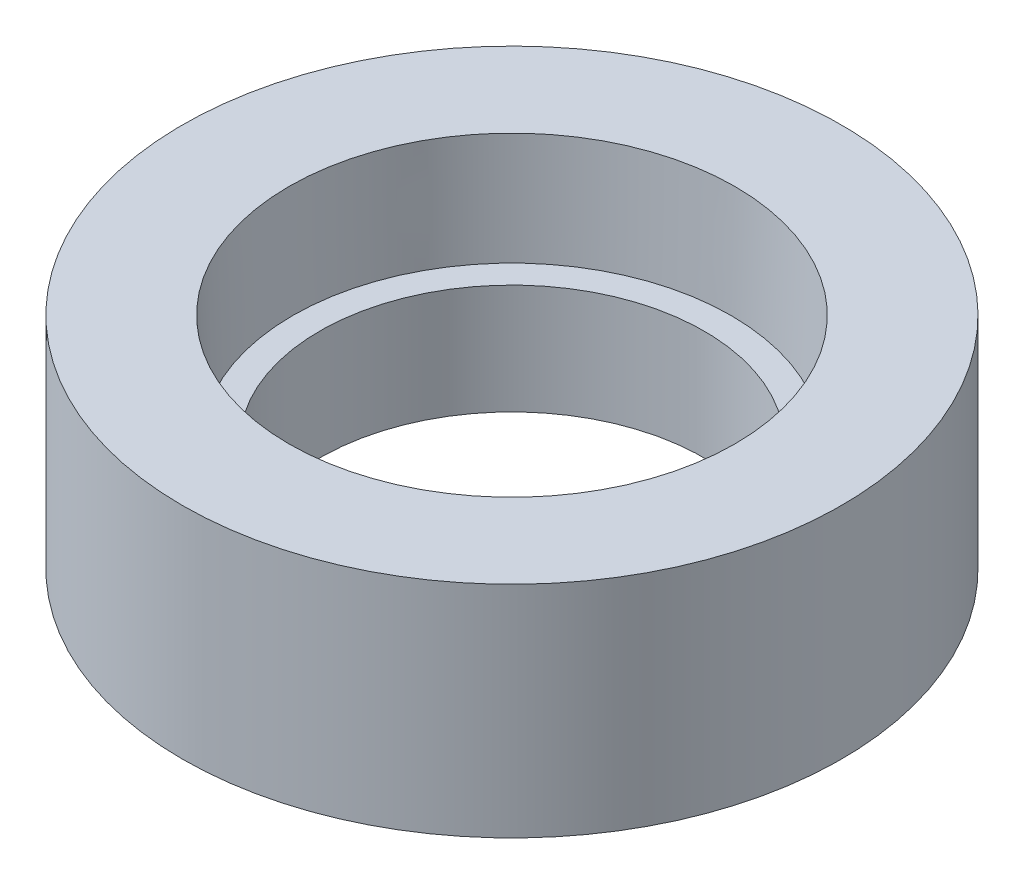
ISO-10303-21;
HEADER;
FILE_DESCRIPTION(('STEP AP214'),'2;1');
FILE_NAME('part.step','',(''),(''),'','','');
FILE_SCHEMA(('AUTOMOTIVE_DESIGN { 1 0 10303 214 1 1 1 1 }'));
ENDSEC;
DATA;
#1=APPLICATION_CONTEXT('core data for automotive mechanical design processes');
#2=APPLICATION_PROTOCOL_DEFINITION('international standard','automotive_design',2000,#1);
#3=PRODUCT_CONTEXT('',#1,'mechanical');
#4=PRODUCT('Part','Part','',(#3));
#5=PRODUCT_RELATED_PRODUCT_CATEGORY('part','',(#4));
#6=PRODUCT_DEFINITION_FORMATION('','',#4);
#7=PRODUCT_DEFINITION_CONTEXT('part definition',#1,'design');
#8=PRODUCT_DEFINITION('design','',#6,#7);
#9=PRODUCT_DEFINITION_SHAPE('','',#8);
#10=(LENGTH_UNIT() NAMED_UNIT(*) SI_UNIT(.MILLI.,.METRE.));
#11=(NAMED_UNIT(*) PLANE_ANGLE_UNIT() SI_UNIT($,.RADIAN.));
#12=(NAMED_UNIT(*) SI_UNIT($,.STERADIAN.) SOLID_ANGLE_UNIT());
#13=UNCERTAINTY_MEASURE_WITH_UNIT(LENGTH_MEASURE(1.E-05),#10,'distance_accuracy_value','');
#14=(GEOMETRIC_REPRESENTATION_CONTEXT(3) GLOBAL_UNCERTAINTY_ASSIGNED_CONTEXT((#13)) GLOBAL_UNIT_ASSIGNED_CONTEXT((#10,
#11,#12)) REPRESENTATION_CONTEXT('',''));
#15=CARTESIAN_POINT('',(0.,0.,0.));
#16=DIRECTION('',(0.,0.,1.));
#17=DIRECTION('',(1.,0.,0.));
#18=AXIS2_PLACEMENT_3D('',#15,#16,#17);
#19=CARTESIAN_POINT('',(0.,25.4,0.));
#20=DIRECTION('',(0.,-1.,0.));
#21=DIRECTION('',(0.,0.,-1.));
#22=AXIS2_PLACEMENT_3D('',#19,#20,#21);
#23=CYLINDRICAL_SURFACE('',#22,22.225);
#24=CARTESIAN_POINT('',(0.,0.,0.));
#25=DIRECTION('',(0.,1.,0.));
#26=DIRECTION('',(0.,0.,1.));
#27=AXIS2_PLACEMENT_3D('',#24,#25,#26);
#28=CIRCLE('',#27,22.225);
#29=CARTESIAN_POINT('',(0.,0.,22.225));
#30=VERTEX_POINT('',#29);
#31=EDGE_CURVE('E52',#30,#30,#28,.T.);
#32=ORIENTED_EDGE('',*,*,#31,.F.);
#33=EDGE_LOOP('',(#32));
#34=FACE_BOUND('',#33,.T.);
#35=CARTESIAN_POINT('',(0.,12.7,0.));
#36=DIRECTION('',(0.,1.,0.));
#37=DIRECTION('',(0.,0.,1.));
#38=AXIS2_PLACEMENT_3D('',#35,#36,#37);
#39=CIRCLE('',#38,22.225);
#40=CARTESIAN_POINT('',(0.,12.7,22.225));
#41=VERTEX_POINT('',#40);
#42=EDGE_CURVE('E41',#41,#41,#39,.T.);
#43=ORIENTED_EDGE('',*,*,#42,.T.);
#44=EDGE_LOOP('',(#43));
#45=FACE_BOUND('',#44,.T.);
#46=ADVANCED_FACE('F37',(#34,#45),#23,.F.);
#47=CARTESIAN_POINT('',(0.,25.4,0.));
#48=DIRECTION('',(0.,1.,0.));
#49=DIRECTION('',(0.,0.,1.));
#50=AXIS2_PLACEMENT_3D('',#47,#48,#49);
#51=PLANE('',#50);
#52=CARTESIAN_POINT('',(0.,25.4,0.));
#53=DIRECTION('',(0.,1.,0.));
#54=DIRECTION('',(0.,0.,1.));
#55=AXIS2_PLACEMENT_3D('',#52,#53,#54);
#56=CIRCLE('',#55,25.7799937725452);
#57=CARTESIAN_POINT('',(0.,25.4,25.7799937725452));
#58=VERTEX_POINT('',#57);
#59=EDGE_CURVE('E57',#58,#58,#56,.T.);
#60=ORIENTED_EDGE('',*,*,#59,.F.);
#61=EDGE_LOOP('',(#60));
#62=FACE_BOUND('',#61,.T.);
#63=CARTESIAN_POINT('',(0.,25.4,0.));
#64=DIRECTION('',(0.,1.,0.));
#65=DIRECTION('',(0.,0.,1.));
#66=AXIS2_PLACEMENT_3D('',#63,#64,#65);
#67=CIRCLE('',#66,38.1);
#68=CARTESIAN_POINT('',(0.,25.4,38.1));
#69=VERTEX_POINT('',#68);
#70=EDGE_CURVE('E10',#69,#69,#67,.T.);
#71=ORIENTED_EDGE('',*,*,#70,.T.);
#72=EDGE_LOOP('',(#71));
#73=FACE_BOUND('',#72,.T.);
#74=ADVANCED_FACE('F82',(#62,#73),#51,.T.);
#75=CARTESIAN_POINT('',(0.,0.,0.));
#76=DIRECTION('',(0.,1.,0.));
#77=DIRECTION('',(0.,0.,1.));
#78=AXIS2_PLACEMENT_3D('',#75,#76,#77);
#79=PLANE('',#78);
#80=CARTESIAN_POINT('',(0.,0.,0.));
#81=DIRECTION('',(0.,1.,0.));
#82=DIRECTION('',(0.,0.,1.));
#83=AXIS2_PLACEMENT_3D('',#80,#81,#82);
#84=CIRCLE('',#83,38.1);
#85=CARTESIAN_POINT('',(0.,0.,38.1));
#86=VERTEX_POINT('',#85);
#87=EDGE_CURVE('E46',#86,#86,#84,.T.);
#88=ORIENTED_EDGE('',*,*,#87,.F.);
#89=EDGE_LOOP('',(#88));
#90=FACE_BOUND('',#89,.T.);
#91=ORIENTED_EDGE('',*,*,#31,.T.);
#92=EDGE_LOOP('',(#91));
#93=FACE_BOUND('',#92,.T.);
#94=ADVANCED_FACE('F78',(#90,#93),#79,.F.);
#95=CARTESIAN_POINT('',(0.,25.4,0.));
#96=DIRECTION('',(0.,-1.,0.));
#97=DIRECTION('',(0.,0.,-1.));
#98=AXIS2_PLACEMENT_3D('',#95,#96,#97);
#99=CYLINDRICAL_SURFACE('',#98,38.1);
#100=ORIENTED_EDGE('',*,*,#70,.F.);
#101=EDGE_LOOP('',(#100));
#102=FACE_BOUND('',#101,.T.);
#103=ORIENTED_EDGE('',*,*,#87,.T.);
#104=EDGE_LOOP('',(#103));
#105=FACE_BOUND('',#104,.T.);
#106=ADVANCED_FACE('F39',(#102,#105),#99,.T.);
#107=CARTESIAN_POINT('',(0.,12.7,0.));
#108=DIRECTION('',(0.,1.,0.));
#109=DIRECTION('',(0.,0.,1.));
#110=AXIS2_PLACEMENT_3D('',#107,#108,#109);
#111=CONICAL_SURFACE('',#110,25.3365,0.0349065850398867);
#112=ORIENTED_EDGE('',*,*,#59,.T.);
#113=EDGE_LOOP('',(#112));
#114=FACE_BOUND('',#113,.T.);
#115=CARTESIAN_POINT('',(0.,12.7,0.));
#116=DIRECTION('',(0.,1.,0.));
#117=DIRECTION('',(0.,0.,1.));
#118=AXIS2_PLACEMENT_3D('',#115,#116,#117);
#119=CIRCLE('',#118,25.3365);
#120=CARTESIAN_POINT('',(0.,12.7,25.3365));
#121=VERTEX_POINT('',#120);
#122=EDGE_CURVE('E61',#121,#121,#119,.T.);
#123=ORIENTED_EDGE('',*,*,#122,.F.);
#124=EDGE_LOOP('',(#123));
#125=FACE_BOUND('',#124,.T.);
#126=ADVANCED_FACE('F68',(#114,#125),#111,.F.);
#127=CARTESIAN_POINT('',(0.,12.7,0.));
#128=DIRECTION('',(0.,1.,0.));
#129=DIRECTION('',(0.,0.,1.));
#130=AXIS2_PLACEMENT_3D('',#127,#128,#129);
#131=PLANE('',#130);
#132=ORIENTED_EDGE('',*,*,#42,.F.);
#133=EDGE_LOOP('',(#132));
#134=FACE_BOUND('',#133,.T.);
#135=ORIENTED_EDGE('',*,*,#122,.T.);
#136=EDGE_LOOP('',(#135));
#137=FACE_BOUND('',#136,.T.);
#138=ADVANCED_FACE('F66',(#134,#137),#131,.T.);
#139=CLOSED_SHELL('',(#46,#74,#94,#106,#126,#138));
#140=MANIFOLD_SOLID_BREP('B2',#139);
#141=ADVANCED_BREP_SHAPE_REPRESENTATION('',(#18,#140),#14);
#142=SHAPE_DEFINITION_REPRESENTATION(#9,#141);
ENDSEC;
END-ISO-10303-21;
